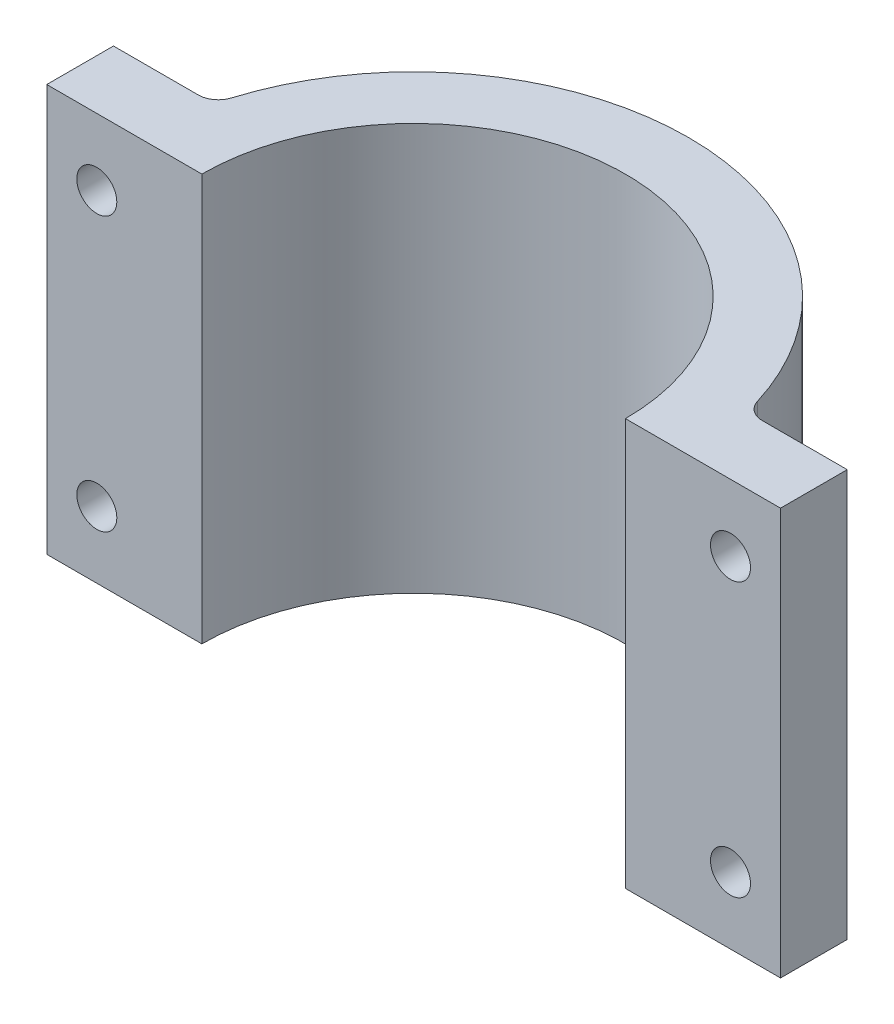
ISO-10303-21;
HEADER;
FILE_DESCRIPTION(('STEP AP214'),'2;1');
FILE_NAME('part.step','',(''),(''),'','','');
FILE_SCHEMA(('AUTOMOTIVE_DESIGN { 1 0 10303 214 1 1 1 1 }'));
ENDSEC;
DATA;
#1=APPLICATION_CONTEXT('core data for automotive mechanical design processes');
#2=APPLICATION_PROTOCOL_DEFINITION('international standard','automotive_design',2000,#1);
#3=PRODUCT_CONTEXT('',#1,'mechanical');
#4=PRODUCT('Part','Part','',(#3));
#5=PRODUCT_RELATED_PRODUCT_CATEGORY('part','',(#4));
#6=PRODUCT_DEFINITION_FORMATION('','',#4);
#7=PRODUCT_DEFINITION_CONTEXT('part definition',#1,'design');
#8=PRODUCT_DEFINITION('design','',#6,#7);
#9=PRODUCT_DEFINITION_SHAPE('','',#8);
#10=(LENGTH_UNIT() NAMED_UNIT(*) SI_UNIT(.MILLI.,.METRE.));
#11=(NAMED_UNIT(*) PLANE_ANGLE_UNIT() SI_UNIT($,.RADIAN.));
#12=(NAMED_UNIT(*) SI_UNIT($,.STERADIAN.) SOLID_ANGLE_UNIT());
#13=UNCERTAINTY_MEASURE_WITH_UNIT(LENGTH_MEASURE(1.E-05),#10,'distance_accuracy_value','');
#14=(GEOMETRIC_REPRESENTATION_CONTEXT(3) GLOBAL_UNCERTAINTY_ASSIGNED_CONTEXT((#13)) GLOBAL_UNIT_ASSIGNED_CONTEXT((#10,
#11,#12)) REPRESENTATION_CONTEXT('',''));
#15=CARTESIAN_POINT('',(0.,0.,0.));
#16=DIRECTION('',(0.,0.,1.));
#17=DIRECTION('',(1.,0.,0.));
#18=AXIS2_PLACEMENT_3D('',#15,#16,#17);
#19=CARTESIAN_POINT('',(0.,61.,41.75));
#20=DIRECTION('',(0.,0.,1.));
#21=DIRECTION('',(1.,0.,0.));
#22=AXIS2_PLACEMENT_3D('',#19,#20,#21);
#23=PLANE('',#22);
#24=CARTESIAN_POINT('',(47.5,10.,41.75));
#25=DIRECTION('',(0.,0.,1.));
#26=DIRECTION('',(1.,0.,0.));
#27=AXIS2_PLACEMENT_3D('',#24,#25,#26);
#28=CIRCLE('',#27,3.);
#29=CARTESIAN_POINT('',(50.5,10.,41.75));
#30=VERTEX_POINT('',#29);
#31=EDGE_CURVE('E258',#30,#30,#28,.T.);
#32=ORIENTED_EDGE('',*,*,#31,.T.);
#33=EDGE_LOOP('',(#32));
#34=FACE_BOUND('',#33,.T.);
#35=CARTESIAN_POINT('',(47.5,51.,41.75));
#36=DIRECTION('',(0.,0.,1.));
#37=DIRECTION('',(1.,0.,0.));
#38=AXIS2_PLACEMENT_3D('',#35,#36,#37);
#39=CIRCLE('',#38,3.);
#40=CARTESIAN_POINT('',(50.5,51.,41.75));
#41=VERTEX_POINT('',#40);
#42=EDGE_CURVE('E260',#41,#41,#39,.T.);
#43=ORIENTED_EDGE('',*,*,#42,.T.);
#44=EDGE_LOOP('',(#43));
#45=FACE_BOUND('',#44,.T.);
#46=DIRECTION('',(-1.,0.,0.));
#47=VECTOR('',#46,1.);
#48=CARTESIAN_POINT('',(0.,0.,41.75));
#49=LINE('',#48,#47);
#50=CARTESIAN_POINT('',(55.,0.,41.75));
#51=VERTEX_POINT('',#50);
#52=CARTESIAN_POINT('',(42.2774920913843,0.,41.75));
#53=VERTEX_POINT('',#52);
#54=EDGE_CURVE('E145',#51,#53,#49,.T.);
#55=ORIENTED_EDGE('',*,*,#54,.T.);
#56=DIRECTION('',(0.,1.,0.));
#57=VECTOR('',#56,1.);
#58=CARTESIAN_POINT('',(42.2774920913843,61.,41.75));
#59=LINE('',#58,#57);
#60=CARTESIAN_POINT('',(42.2774920913843,61.,41.75));
#61=VERTEX_POINT('',#60);
#62=EDGE_CURVE('E180',#53,#61,#59,.T.);
#63=ORIENTED_EDGE('',*,*,#62,.T.);
#64=DIRECTION('',(-1.,0.,0.));
#65=VECTOR('',#64,1.);
#66=CARTESIAN_POINT('',(0.,61.,41.75));
#67=LINE('',#66,#65);
#68=CARTESIAN_POINT('',(55.,61.,41.75));
#69=VERTEX_POINT('',#68);
#70=EDGE_CURVE('E166',#69,#61,#67,.T.);
#71=ORIENTED_EDGE('',*,*,#70,.F.);
#72=DIRECTION('',(0.,-1.,0.));
#73=VECTOR('',#72,1.);
#74=CARTESIAN_POINT('',(55.,61.,41.75));
#75=LINE('',#74,#73);
#76=EDGE_CURVE('E144',#69,#51,#75,.T.);
#77=ORIENTED_EDGE('',*,*,#76,.T.);
#78=EDGE_LOOP('',(#55,#63,#71,#77));
#79=FACE_BOUND('',#78,.T.);
#80=ADVANCED_FACE('F34',(#34,#45,#79),#23,.F.);
#81=CARTESIAN_POINT('',(0.,61.,51.75));
#82=DIRECTION('',(0.,-1.,0.));
#83=DIRECTION('',(0.,0.,-1.));
#84=AXIS2_PLACEMENT_3D('',#81,#82,#83);
#85=CYLINDRICAL_SURFACE('',#84,41.2310562561766);
#86=CARTESIAN_POINT('',(0.,61.,51.75));
#87=DIRECTION('',(0.,1.,0.));
#88=DIRECTION('',(0.,0.,1.));
#89=AXIS2_PLACEMENT_3D('',#86,#87,#88);
#90=CIRCLE('',#89,41.2310562561766);
#91=CARTESIAN_POINT('',(39.409993844461,61.,39.6317334086286));
#92=VERTEX_POINT('',#91);
#93=CARTESIAN_POINT('',(-39.409993844461,61.,39.6317334086286));
#94=VERTEX_POINT('',#93);
#95=EDGE_CURVE('E128',#92,#94,#90,.T.);
#96=ORIENTED_EDGE('',*,*,#95,.F.);
#97=DIRECTION('',(0.,-1.,0.));
#98=VECTOR('',#97,1.);
#99=CARTESIAN_POINT('',(39.409993844461,61.,39.6317334086286));
#100=LINE('',#99,#98);
#101=CARTESIAN_POINT('',(39.409993844461,0.,39.6317334086286));
#102=VERTEX_POINT('',#101);
#103=EDGE_CURVE('E177',#92,#102,#100,.T.);
#104=ORIENTED_EDGE('',*,*,#103,.T.);
#105=CARTESIAN_POINT('',(0.,0.,51.75));
#106=DIRECTION('',(0.,1.,0.));
#107=DIRECTION('',(0.,0.,1.));
#108=AXIS2_PLACEMENT_3D('',#105,#106,#107);
#109=CIRCLE('',#108,41.2310562561766);
#110=CARTESIAN_POINT('',(-39.409993844461,0.,39.6317334086286));
#111=VERTEX_POINT('',#110);
#112=EDGE_CURVE('E148',#102,#111,#109,.T.);
#113=ORIENTED_EDGE('',*,*,#112,.T.);
#114=DIRECTION('',(0.,-1.,0.));
#115=VECTOR('',#114,1.);
#116=CARTESIAN_POINT('',(-39.409993844461,61.,39.6317334086286));
#117=LINE('',#116,#115);
#118=EDGE_CURVE('E119',#111,#94,#117,.F.);
#119=ORIENTED_EDGE('',*,*,#118,.T.);
#120=EDGE_LOOP('',(#96,#104,#113,#119));
#121=FACE_BOUND('',#120,.T.);
#122=ADVANCED_FACE('F193',(#121),#85,.T.);
#123=CARTESIAN_POINT('',(0.,61.,41.75));
#124=DIRECTION('',(0.,0.,-1.));
#125=DIRECTION('',(-1.,0.,0.));
#126=AXIS2_PLACEMENT_3D('',#123,#124,#125);
#127=PLANE('',#126);
#128=CARTESIAN_POINT('',(-47.5,51.,41.75));
#129=DIRECTION('',(0.,0.,-1.));
#130=DIRECTION('',(-1.,0.,0.));
#131=AXIS2_PLACEMENT_3D('',#128,#129,#130);
#132=CIRCLE('',#131,2.99999999999999);
#133=CARTESIAN_POINT('',(-50.5,51.,41.75));
#134=VERTEX_POINT('',#133);
#135=EDGE_CURVE('E149',#134,#134,#132,.T.);
#136=ORIENTED_EDGE('',*,*,#135,.F.);
#137=EDGE_LOOP('',(#136));
#138=FACE_BOUND('',#137,.T.);
#139=CARTESIAN_POINT('',(-47.5,10.,41.75));
#140=DIRECTION('',(0.,0.,-1.));
#141=DIRECTION('',(-1.,0.,0.));
#142=AXIS2_PLACEMENT_3D('',#139,#140,#141);
#143=CIRCLE('',#142,3.00000000000001);
#144=CARTESIAN_POINT('',(-50.5,10.,41.75));
#145=VERTEX_POINT('',#144);
#146=EDGE_CURVE('E259',#145,#145,#143,.T.);
#147=ORIENTED_EDGE('',*,*,#146,.F.);
#148=EDGE_LOOP('',(#147));
#149=FACE_BOUND('',#148,.T.);
#150=DIRECTION('',(1.,0.,0.));
#151=VECTOR('',#150,1.);
#152=CARTESIAN_POINT('',(0.,61.,41.75));
#153=LINE('',#152,#151);
#154=CARTESIAN_POINT('',(-55.,61.,41.75));
#155=VERTEX_POINT('',#154);
#156=CARTESIAN_POINT('',(-42.2774920913843,61.,41.75));
#157=VERTEX_POINT('',#156);
#158=EDGE_CURVE('E112',#155,#157,#153,.T.);
#159=ORIENTED_EDGE('',*,*,#158,.T.);
#160=DIRECTION('',(0.,-1.,0.));
#161=VECTOR('',#160,1.);
#162=CARTESIAN_POINT('',(-42.2774920913843,61.,41.75));
#163=LINE('',#162,#161);
#164=CARTESIAN_POINT('',(-42.2774920913843,0.,41.75));
#165=VERTEX_POINT('',#164);
#166=EDGE_CURVE('E182',#157,#165,#163,.T.);
#167=ORIENTED_EDGE('',*,*,#166,.T.);
#168=DIRECTION('',(1.,0.,0.));
#169=VECTOR('',#168,1.);
#170=CARTESIAN_POINT('',(0.,0.,41.75));
#171=LINE('',#170,#169);
#172=CARTESIAN_POINT('',(-55.,0.,41.75));
#173=VERTEX_POINT('',#172);
#174=EDGE_CURVE('E114',#173,#165,#171,.T.);
#175=ORIENTED_EDGE('',*,*,#174,.F.);
#176=DIRECTION('',(0.,-1.,0.));
#177=VECTOR('',#176,1.);
#178=CARTESIAN_POINT('',(-55.,61.,41.75));
#179=LINE('',#178,#177);
#180=EDGE_CURVE('E110',#155,#173,#179,.T.);
#181=ORIENTED_EDGE('',*,*,#180,.F.);
#182=EDGE_LOOP('',(#159,#167,#175,#181));
#183=FACE_BOUND('',#182,.T.);
#184=ADVANCED_FACE('F111',(#138,#149,#183),#127,.T.);
#185=CARTESIAN_POINT('',(-55.,61.,0.));
#186=DIRECTION('',(-1.,0.,0.));
#187=DIRECTION('',(0.,0.,1.));
#188=AXIS2_PLACEMENT_3D('',#185,#186,#187);
#189=PLANE('',#188);
#190=DIRECTION('',(0.,0.,-1.));
#191=VECTOR('',#190,1.);
#192=CARTESIAN_POINT('',(-55.,0.,0.));
#193=LINE('',#192,#191);
#194=CARTESIAN_POINT('',(-55.,0.,51.75));
#195=VERTEX_POINT('',#194);
#196=EDGE_CURVE('E153',#195,#173,#193,.T.);
#197=ORIENTED_EDGE('',*,*,#196,.F.);
#198=DIRECTION('',(0.,-1.,0.));
#199=VECTOR('',#198,1.);
#200=CARTESIAN_POINT('',(-55.,61.,51.75));
#201=LINE('',#200,#199);
#202=CARTESIAN_POINT('',(-55.,61.,51.75));
#203=VERTEX_POINT('',#202);
#204=EDGE_CURVE('E120',#203,#195,#201,.T.);
#205=ORIENTED_EDGE('',*,*,#204,.F.);
#206=DIRECTION('',(0.,0.,-1.));
#207=VECTOR('',#206,1.);
#208=CARTESIAN_POINT('',(-55.,61.,0.));
#209=LINE('',#208,#207);
#210=EDGE_CURVE('E126',#203,#155,#209,.T.);
#211=ORIENTED_EDGE('',*,*,#210,.T.);
#212=ORIENTED_EDGE('',*,*,#180,.T.);
#213=EDGE_LOOP('',(#197,#205,#211,#212));
#214=FACE_BOUND('',#213,.T.);
#215=ADVANCED_FACE('F130',(#214),#189,.T.);
#216=CARTESIAN_POINT('',(0.,61.,51.75));
#217=DIRECTION('',(0.,0.,1.));
#218=DIRECTION('',(1.,0.,0.));
#219=AXIS2_PLACEMENT_3D('',#216,#217,#218);
#220=PLANE('',#219);
#221=CARTESIAN_POINT('',(-47.5,51.,51.75));
#222=DIRECTION('',(0.,0.,-1.));
#223=DIRECTION('',(1.,0.,0.));
#224=AXIS2_PLACEMENT_3D('',#221,#222,#223);
#225=CIRCLE('',#224,2.99999999999999);
#226=CARTESIAN_POINT('',(-44.5,51.,51.75));
#227=VERTEX_POINT('',#226);
#228=EDGE_CURVE('E294',#227,#227,#225,.T.);
#229=ORIENTED_EDGE('',*,*,#228,.T.);
#230=EDGE_LOOP('',(#229));
#231=FACE_BOUND('',#230,.T.);
#232=CARTESIAN_POINT('',(-47.5,10.,51.75));
#233=DIRECTION('',(0.,0.,-1.));
#234=DIRECTION('',(1.,0.,0.));
#235=AXIS2_PLACEMENT_3D('',#232,#233,#234);
#236=CIRCLE('',#235,3.00000000000001);
#237=CARTESIAN_POINT('',(-44.5,10.,51.75));
#238=VERTEX_POINT('',#237);
#239=EDGE_CURVE('E292',#238,#238,#236,.T.);
#240=ORIENTED_EDGE('',*,*,#239,.T.);
#241=EDGE_LOOP('',(#240));
#242=FACE_BOUND('',#241,.T.);
#243=DIRECTION('',(-1.,0.,0.));
#244=VECTOR('',#243,1.);
#245=CARTESIAN_POINT('',(0.,0.,51.75));
#246=LINE('',#245,#244);
#247=CARTESIAN_POINT('',(-31.75,0.,51.75));
#248=VERTEX_POINT('',#247);
#249=EDGE_CURVE('E155',#248,#195,#246,.T.);
#250=ORIENTED_EDGE('',*,*,#249,.F.);
#251=DIRECTION('',(0.,-1.,0.));
#252=VECTOR('',#251,1.);
#253=CARTESIAN_POINT('',(-31.75,61.,51.75));
#254=LINE('',#253,#252);
#255=CARTESIAN_POINT('',(-31.75,61.,51.75));
#256=VERTEX_POINT('',#255);
#257=EDGE_CURVE('E173',#256,#248,#254,.T.);
#258=ORIENTED_EDGE('',*,*,#257,.F.);
#259=DIRECTION('',(-1.,0.,0.));
#260=VECTOR('',#259,1.);
#261=CARTESIAN_POINT('',(0.,61.,51.75));
#262=LINE('',#261,#260);
#263=EDGE_CURVE('E131',#256,#203,#262,.T.);
#264=ORIENTED_EDGE('',*,*,#263,.T.);
#265=ORIENTED_EDGE('',*,*,#204,.T.);
#266=EDGE_LOOP('',(#250,#258,#264,#265));
#267=FACE_BOUND('',#266,.T.);
#268=ADVANCED_FACE('F217',(#231,#242,#267),#220,.T.);
#269=CARTESIAN_POINT('',(0.,61.,51.75));
#270=DIRECTION('',(0.,-1.,0.));
#271=DIRECTION('',(0.,0.,-1.));
#272=AXIS2_PLACEMENT_3D('',#269,#270,#271);
#273=CYLINDRICAL_SURFACE('',#272,31.75);
#274=CARTESIAN_POINT('',(0.,0.,51.75));
#275=DIRECTION('',(0.,1.,0.));
#276=DIRECTION('',(0.,0.,1.));
#277=AXIS2_PLACEMENT_3D('',#274,#275,#276);
#278=CIRCLE('',#277,31.75);
#279=CARTESIAN_POINT('',(31.75,0.,51.75));
#280=VERTEX_POINT('',#279);
#281=EDGE_CURVE('E158',#280,#248,#278,.T.);
#282=ORIENTED_EDGE('',*,*,#281,.F.);
#283=DIRECTION('',(0.,-1.,0.));
#284=VECTOR('',#283,1.);
#285=CARTESIAN_POINT('',(31.75,61.,51.75));
#286=LINE('',#285,#284);
#287=CARTESIAN_POINT('',(31.75,61.,51.75));
#288=VERTEX_POINT('',#287);
#289=EDGE_CURVE('E171',#288,#280,#286,.T.);
#290=ORIENTED_EDGE('',*,*,#289,.F.);
#291=CARTESIAN_POINT('',(0.,61.,51.75));
#292=DIRECTION('',(0.,1.,0.));
#293=DIRECTION('',(0.,0.,1.));
#294=AXIS2_PLACEMENT_3D('',#291,#292,#293);
#295=CIRCLE('',#294,31.75);
#296=EDGE_CURVE('E133',#288,#256,#295,.T.);
#297=ORIENTED_EDGE('',*,*,#296,.T.);
#298=ORIENTED_EDGE('',*,*,#257,.T.);
#299=EDGE_LOOP('',(#282,#290,#297,#298));
#300=FACE_BOUND('',#299,.T.);
#301=ADVANCED_FACE('F220',(#300),#273,.F.);
#302=CARTESIAN_POINT('',(0.,61.,51.75));
#303=DIRECTION('',(0.,0.,1.));
#304=DIRECTION('',(1.,0.,0.));
#305=AXIS2_PLACEMENT_3D('',#302,#303,#304);
#306=PLANE('',#305);
#307=CARTESIAN_POINT('',(47.5,10.,51.75));
#308=DIRECTION('',(0.,0.,-1.));
#309=DIRECTION('',(-1.,0.,0.));
#310=AXIS2_PLACEMENT_3D('',#307,#308,#309);
#311=CIRCLE('',#310,3.);
#312=CARTESIAN_POINT('',(44.5,10.,51.75));
#313=VERTEX_POINT('',#312);
#314=EDGE_CURVE('E256',#313,#313,#311,.T.);
#315=ORIENTED_EDGE('',*,*,#314,.T.);
#316=EDGE_LOOP('',(#315));
#317=FACE_BOUND('',#316,.T.);
#318=CARTESIAN_POINT('',(47.5,51.,51.75));
#319=DIRECTION('',(0.,0.,-1.));
#320=DIRECTION('',(-1.,0.,0.));
#321=AXIS2_PLACEMENT_3D('',#318,#319,#320);
#322=CIRCLE('',#321,3.);
#323=CARTESIAN_POINT('',(44.5,51.,51.75));
#324=VERTEX_POINT('',#323);
#325=EDGE_CURVE('E265',#324,#324,#322,.T.);
#326=ORIENTED_EDGE('',*,*,#325,.T.);
#327=EDGE_LOOP('',(#326));
#328=FACE_BOUND('',#327,.T.);
#329=DIRECTION('',(-1.,0.,0.));
#330=VECTOR('',#329,1.);
#331=CARTESIAN_POINT('',(0.,0.,51.75));
#332=LINE('',#331,#330);
#333=CARTESIAN_POINT('',(55.,0.,51.75));
#334=VERTEX_POINT('',#333);
#335=EDGE_CURVE('E161',#334,#280,#332,.T.);
#336=ORIENTED_EDGE('',*,*,#335,.F.);
#337=DIRECTION('',(0.,-1.,0.));
#338=VECTOR('',#337,1.);
#339=CARTESIAN_POINT('',(55.,61.,51.75));
#340=LINE('',#339,#338);
#341=CARTESIAN_POINT('',(55.,61.,51.75));
#342=VERTEX_POINT('',#341);
#343=EDGE_CURVE('E169',#342,#334,#340,.T.);
#344=ORIENTED_EDGE('',*,*,#343,.F.);
#345=DIRECTION('',(-1.,0.,0.));
#346=VECTOR('',#345,1.);
#347=CARTESIAN_POINT('',(0.,61.,51.75));
#348=LINE('',#347,#346);
#349=EDGE_CURVE('E139',#342,#288,#348,.T.);
#350=ORIENTED_EDGE('',*,*,#349,.T.);
#351=ORIENTED_EDGE('',*,*,#289,.T.);
#352=EDGE_LOOP('',(#336,#344,#350,#351));
#353=FACE_BOUND('',#352,.T.);
#354=ADVANCED_FACE('F224',(#317,#328,#353),#306,.T.);
#355=CARTESIAN_POINT('',(55.,61.,0.));
#356=DIRECTION('',(-1.,0.,0.));
#357=DIRECTION('',(0.,0.,1.));
#358=AXIS2_PLACEMENT_3D('',#355,#356,#357);
#359=PLANE('',#358);
#360=DIRECTION('',(0.,0.,-1.));
#361=VECTOR('',#360,1.);
#362=CARTESIAN_POINT('',(55.,0.,0.));
#363=LINE('',#362,#361);
#364=EDGE_CURVE('E164',#334,#51,#363,.T.);
#365=ORIENTED_EDGE('',*,*,#364,.T.);
#366=ORIENTED_EDGE('',*,*,#76,.F.);
#367=DIRECTION('',(0.,0.,-1.));
#368=VECTOR('',#367,1.);
#369=CARTESIAN_POINT('',(55.,61.,0.));
#370=LINE('',#369,#368);
#371=EDGE_CURVE('E142',#342,#69,#370,.T.);
#372=ORIENTED_EDGE('',*,*,#371,.F.);
#373=ORIENTED_EDGE('',*,*,#343,.T.);
#374=EDGE_LOOP('',(#365,#366,#372,#373));
#375=FACE_BOUND('',#374,.T.);
#376=ADVANCED_FACE('F228',(#375),#359,.F.);
#377=CARTESIAN_POINT('',(0.,61.,0.));
#378=DIRECTION('',(0.,1.,0.));
#379=DIRECTION('',(0.,0.,1.));
#380=AXIS2_PLACEMENT_3D('',#377,#378,#379);
#381=PLANE('',#380);
#382=ORIENTED_EDGE('',*,*,#70,.T.);
#383=CARTESIAN_POINT('',(42.2774920913843,61.,38.75));
#384=DIRECTION('',(0.,1.,0.));
#385=DIRECTION('',(0.,0.,1.));
#386=AXIS2_PLACEMENT_3D('',#383,#384,#385);
#387=CIRCLE('',#386,3.);
#388=EDGE_CURVE('E186',#61,#92,#387,.F.);
#389=ORIENTED_EDGE('',*,*,#388,.T.);
#390=ORIENTED_EDGE('',*,*,#95,.T.);
#391=CARTESIAN_POINT('',(-42.2774920913843,61.,38.75));
#392=DIRECTION('',(0.,1.,0.));
#393=DIRECTION('',(0.,0.,1.));
#394=AXIS2_PLACEMENT_3D('',#391,#392,#393);
#395=CIRCLE('',#394,3.);
#396=EDGE_CURVE('E11',#94,#157,#395,.F.);
#397=ORIENTED_EDGE('',*,*,#396,.T.);
#398=ORIENTED_EDGE('',*,*,#158,.F.);
#399=ORIENTED_EDGE('',*,*,#210,.F.);
#400=ORIENTED_EDGE('',*,*,#263,.F.);
#401=ORIENTED_EDGE('',*,*,#296,.F.);
#402=ORIENTED_EDGE('',*,*,#349,.F.);
#403=ORIENTED_EDGE('',*,*,#371,.T.);
#404=EDGE_LOOP('',(#382,#389,#390,#397,#398,#399,#400,#401,#402,#403));
#405=FACE_BOUND('',#404,.T.);
#406=ADVANCED_FACE('F124',(#405),#381,.T.);
#407=CARTESIAN_POINT('',(0.,0.,0.));
#408=DIRECTION('',(0.,1.,0.));
#409=DIRECTION('',(0.,0.,1.));
#410=AXIS2_PLACEMENT_3D('',#407,#408,#409);
#411=PLANE('',#410);
#412=ORIENTED_EDGE('',*,*,#54,.F.);
#413=ORIENTED_EDGE('',*,*,#364,.F.);
#414=ORIENTED_EDGE('',*,*,#335,.T.);
#415=ORIENTED_EDGE('',*,*,#281,.T.);
#416=ORIENTED_EDGE('',*,*,#249,.T.);
#417=ORIENTED_EDGE('',*,*,#196,.T.);
#418=ORIENTED_EDGE('',*,*,#174,.T.);
#419=CARTESIAN_POINT('',(-42.2774920913843,0.,38.75));
#420=DIRECTION('',(0.,1.,0.));
#421=DIRECTION('',(0.,0.,1.));
#422=AXIS2_PLACEMENT_3D('',#419,#420,#421);
#423=CIRCLE('',#422,3.);
#424=EDGE_CURVE('E42',#165,#111,#423,.T.);
#425=ORIENTED_EDGE('',*,*,#424,.T.);
#426=ORIENTED_EDGE('',*,*,#112,.F.);
#427=CARTESIAN_POINT('',(42.2774920913843,0.,38.75));
#428=DIRECTION('',(0.,1.,0.));
#429=DIRECTION('',(0.,0.,1.));
#430=AXIS2_PLACEMENT_3D('',#427,#428,#429);
#431=CIRCLE('',#430,3.);
#432=EDGE_CURVE('E184',#102,#53,#431,.T.);
#433=ORIENTED_EDGE('',*,*,#432,.T.);
#434=EDGE_LOOP('',(#412,#413,#414,#415,#416,#417,#418,#425,#426,#433));
#435=FACE_BOUND('',#434,.T.);
#436=ADVANCED_FACE('F190',(#435),#411,.F.);
#437=CARTESIAN_POINT('',(47.5,51.,51.75));
#438=DIRECTION('',(0.,0.,-1.));
#439=DIRECTION('',(-1.,0.,0.));
#440=AXIS2_PLACEMENT_3D('',#437,#438,#439);
#441=CYLINDRICAL_SURFACE('',#440,3.);
#442=ORIENTED_EDGE('',*,*,#325,.F.);
#443=EDGE_LOOP('',(#442));
#444=FACE_BOUND('',#443,.T.);
#445=ORIENTED_EDGE('',*,*,#42,.F.);
#446=EDGE_LOOP('',(#445));
#447=FACE_BOUND('',#446,.T.);
#448=ADVANCED_FACE('F235',(#444,#447),#441,.F.);
#449=CARTESIAN_POINT('',(47.5,10.,51.75));
#450=DIRECTION('',(0.,0.,-1.));
#451=DIRECTION('',(-1.,0.,0.));
#452=AXIS2_PLACEMENT_3D('',#449,#450,#451);
#453=CYLINDRICAL_SURFACE('',#452,3.);
#454=ORIENTED_EDGE('',*,*,#314,.F.);
#455=EDGE_LOOP('',(#454));
#456=FACE_BOUND('',#455,.T.);
#457=ORIENTED_EDGE('',*,*,#31,.F.);
#458=EDGE_LOOP('',(#457));
#459=FACE_BOUND('',#458,.T.);
#460=ADVANCED_FACE('F240',(#456,#459),#453,.F.);
#461=CARTESIAN_POINT('',(-47.5,10.,51.75));
#462=DIRECTION('',(0.,0.,-1.));
#463=DIRECTION('',(-1.,0.,0.));
#464=AXIS2_PLACEMENT_3D('',#461,#462,#463);
#465=CYLINDRICAL_SURFACE('',#464,3.00000000000001);
#466=ORIENTED_EDGE('',*,*,#146,.T.);
#467=EDGE_LOOP('',(#466));
#468=FACE_BOUND('',#467,.T.);
#469=ORIENTED_EDGE('',*,*,#239,.F.);
#470=EDGE_LOOP('',(#469));
#471=FACE_BOUND('',#470,.T.);
#472=ADVANCED_FACE('F244',(#468,#471),#465,.F.);
#473=CARTESIAN_POINT('',(-47.5,51.,51.75));
#474=DIRECTION('',(0.,0.,-1.));
#475=DIRECTION('',(-1.,0.,0.));
#476=AXIS2_PLACEMENT_3D('',#473,#474,#475);
#477=CYLINDRICAL_SURFACE('',#476,2.99999999999999);
#478=ORIENTED_EDGE('',*,*,#135,.T.);
#479=EDGE_LOOP('',(#478));
#480=FACE_BOUND('',#479,.T.);
#481=ORIENTED_EDGE('',*,*,#228,.F.);
#482=EDGE_LOOP('',(#481));
#483=FACE_BOUND('',#482,.T.);
#484=ADVANCED_FACE('F200',(#480,#483),#477,.F.);
#485=CARTESIAN_POINT('',(42.2774920913843,61.,38.75));
#486=DIRECTION('',(0.,-1.,0.));
#487=DIRECTION('',(0.,0.,-1.));
#488=AXIS2_PLACEMENT_3D('',#485,#486,#487);
#489=CYLINDRICAL_SURFACE('',#488,3.);
#490=ORIENTED_EDGE('',*,*,#388,.F.);
#491=ORIENTED_EDGE('',*,*,#62,.F.);
#492=ORIENTED_EDGE('',*,*,#432,.F.);
#493=ORIENTED_EDGE('',*,*,#103,.F.);
#494=EDGE_LOOP('',(#490,#491,#492,#493));
#495=FACE_BOUND('',#494,.T.);
#496=ADVANCED_FACE('F196',(#495),#489,.F.);
#497=CARTESIAN_POINT('',(-42.2774920913843,61.,38.75));
#498=DIRECTION('',(0.,-1.,0.));
#499=DIRECTION('',(0.,0.,-1.));
#500=AXIS2_PLACEMENT_3D('',#497,#498,#499);
#501=CYLINDRICAL_SURFACE('',#500,3.);
#502=ORIENTED_EDGE('',*,*,#396,.F.);
#503=ORIENTED_EDGE('',*,*,#118,.F.);
#504=ORIENTED_EDGE('',*,*,#424,.F.);
#505=ORIENTED_EDGE('',*,*,#166,.F.);
#506=EDGE_LOOP('',(#502,#503,#504,#505));
#507=FACE_BOUND('',#506,.T.);
#508=ADVANCED_FACE('F36',(#507),#501,.F.);
#509=CLOSED_SHELL('',(#80,#122,#184,#215,#268,#301,#354,#376,#406,#436,#448,#460,#472,#484,#496,#508));
#510=MANIFOLD_SOLID_BREP('B2',#509);
#511=ADVANCED_BREP_SHAPE_REPRESENTATION('',(#18,#510),#14);
#512=SHAPE_DEFINITION_REPRESENTATION(#9,#511);
ENDSEC;
END-ISO-10303-21;
